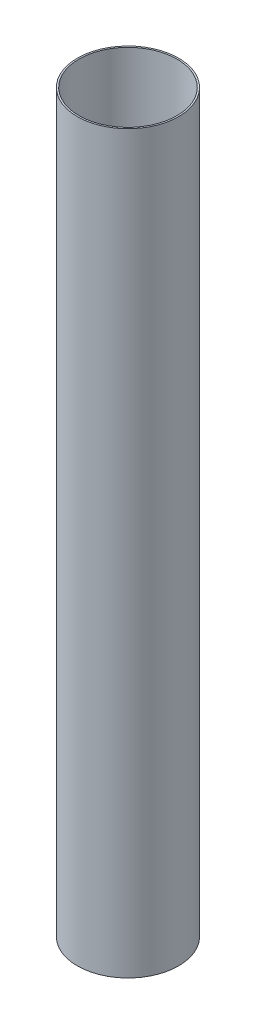
ISO-10303-21;
HEADER;
FILE_DESCRIPTION(('STEP AP214'),'2;1');
FILE_NAME('part.step','',(''),(''),'','','');
FILE_SCHEMA(('AUTOMOTIVE_DESIGN { 1 0 10303 214 1 1 1 1 }'));
ENDSEC;
DATA;
#1=APPLICATION_CONTEXT('core data for automotive mechanical design processes');
#2=APPLICATION_PROTOCOL_DEFINITION('international standard','automotive_design',2000,#1);
#3=PRODUCT_CONTEXT('',#1,'mechanical');
#4=PRODUCT('Part','Part','',(#3));
#5=PRODUCT_RELATED_PRODUCT_CATEGORY('part','',(#4));
#6=PRODUCT_DEFINITION_FORMATION('','',#4);
#7=PRODUCT_DEFINITION_CONTEXT('part definition',#1,'design');
#8=PRODUCT_DEFINITION('design','',#6,#7);
#9=PRODUCT_DEFINITION_SHAPE('','',#8);
#10=(LENGTH_UNIT() NAMED_UNIT(*) SI_UNIT(.MILLI.,.METRE.));
#11=(NAMED_UNIT(*) PLANE_ANGLE_UNIT() SI_UNIT($,.RADIAN.));
#12=(NAMED_UNIT(*) SI_UNIT($,.STERADIAN.) SOLID_ANGLE_UNIT());
#13=UNCERTAINTY_MEASURE_WITH_UNIT(LENGTH_MEASURE(1.E-05),#10,'distance_accuracy_value','');
#14=(GEOMETRIC_REPRESENTATION_CONTEXT(3) GLOBAL_UNCERTAINTY_ASSIGNED_CONTEXT((#13)) GLOBAL_UNIT_ASSIGNED_CONTEXT((#10,
#11,#12)) REPRESENTATION_CONTEXT('',''));
#15=CARTESIAN_POINT('',(0.,0.,0.));
#16=DIRECTION('',(0.,0.,1.));
#17=DIRECTION('',(1.,0.,0.));
#18=AXIS2_PLACEMENT_3D('',#15,#16,#17);
#19=CARTESIAN_POINT('',(0.,1140.,0.));
#20=DIRECTION('',(0.,1.,0.));
#21=DIRECTION('',(0.,0.,1.));
#22=AXIS2_PLACEMENT_3D('',#19,#20,#21);
#23=PLANE('',#22);
#24=CARTESIAN_POINT('',(0.,1140.,0.));
#25=DIRECTION('',(0.,1.,0.));
#26=DIRECTION('',(0.,0.,1.));
#27=AXIS2_PLACEMENT_3D('',#24,#25,#26);
#28=CIRCLE('',#27,78.5);
#29=CARTESIAN_POINT('',(0.,1140.,78.5));
#30=VERTEX_POINT('',#29);
#31=EDGE_CURVE('E10',#30,#30,#28,.T.);
#32=ORIENTED_EDGE('',*,*,#31,.T.);
#33=EDGE_LOOP('',(#32));
#34=FACE_BOUND('',#33,.T.);
#35=CARTESIAN_POINT('',(0.,1140.,0.));
#36=DIRECTION('',(0.,1.,0.));
#37=DIRECTION('',(0.,0.,1.));
#38=AXIS2_PLACEMENT_3D('',#35,#36,#37);
#39=CIRCLE('',#38,76.);
#40=CARTESIAN_POINT('',(0.,1140.,76.));
#41=VERTEX_POINT('',#40);
#42=EDGE_CURVE('E56',#41,#41,#39,.T.);
#43=ORIENTED_EDGE('',*,*,#42,.F.);
#44=EDGE_LOOP('',(#43));
#45=FACE_BOUND('',#44,.T.);
#46=ADVANCED_FACE('F43',(#34,#45),#23,.T.);
#47=CARTESIAN_POINT('',(0.,0.,0.));
#48=DIRECTION('',(0.,1.,0.));
#49=DIRECTION('',(0.,0.,1.));
#50=AXIS2_PLACEMENT_3D('',#47,#48,#49);
#51=PLANE('',#50);
#52=CARTESIAN_POINT('',(0.,0.,0.));
#53=DIRECTION('',(0.,1.,0.));
#54=DIRECTION('',(0.,0.,1.));
#55=AXIS2_PLACEMENT_3D('',#52,#53,#54);
#56=CIRCLE('',#55,78.5);
#57=CARTESIAN_POINT('',(0.,0.,78.5));
#58=VERTEX_POINT('',#57);
#59=EDGE_CURVE('E47',#58,#58,#56,.T.);
#60=ORIENTED_EDGE('',*,*,#59,.F.);
#61=EDGE_LOOP('',(#60));
#62=FACE_BOUND('',#61,.T.);
#63=CARTESIAN_POINT('',(0.,0.,0.));
#64=DIRECTION('',(0.,1.,0.));
#65=DIRECTION('',(0.,0.,1.));
#66=AXIS2_PLACEMENT_3D('',#63,#64,#65);
#67=CIRCLE('',#66,76.);
#68=CARTESIAN_POINT('',(0.,0.,76.));
#69=VERTEX_POINT('',#68);
#70=EDGE_CURVE('E58',#69,#69,#67,.T.);
#71=ORIENTED_EDGE('',*,*,#70,.T.);
#72=EDGE_LOOP('',(#71));
#73=FACE_BOUND('',#72,.T.);
#74=ADVANCED_FACE('F70',(#62,#73),#51,.F.);
#75=CARTESIAN_POINT('',(0.,1140.,0.));
#76=DIRECTION('',(0.,-1.,0.));
#77=DIRECTION('',(0.,0.,-1.));
#78=AXIS2_PLACEMENT_3D('',#75,#76,#77);
#79=CYLINDRICAL_SURFACE('',#78,78.5);
#80=ORIENTED_EDGE('',*,*,#31,.F.);
#81=EDGE_LOOP('',(#80));
#82=FACE_BOUND('',#81,.T.);
#83=ORIENTED_EDGE('',*,*,#59,.T.);
#84=EDGE_LOOP('',(#83));
#85=FACE_BOUND('',#84,.T.);
#86=ADVANCED_FACE('F45',(#82,#85),#79,.T.);
#87=CARTESIAN_POINT('',(0.,1140.,0.));
#88=DIRECTION('',(0.,-1.,0.));
#89=DIRECTION('',(0.,0.,-1.));
#90=AXIS2_PLACEMENT_3D('',#87,#88,#89);
#91=CYLINDRICAL_SURFACE('',#90,76.);
#92=ORIENTED_EDGE('',*,*,#42,.T.);
#93=EDGE_LOOP('',(#92));
#94=FACE_BOUND('',#93,.T.);
#95=ORIENTED_EDGE('',*,*,#70,.F.);
#96=EDGE_LOOP('',(#95));
#97=FACE_BOUND('',#96,.T.);
#98=ADVANCED_FACE('F66',(#94,#97),#91,.F.);
#99=CLOSED_SHELL('',(#46,#74,#86,#98));
#100=MANIFOLD_SOLID_BREP('B2',#99);
#101=ADVANCED_BREP_SHAPE_REPRESENTATION('',(#18,#100),#14);
#102=SHAPE_DEFINITION_REPRESENTATION(#9,#101);
ENDSEC;
END-ISO-10303-21;
